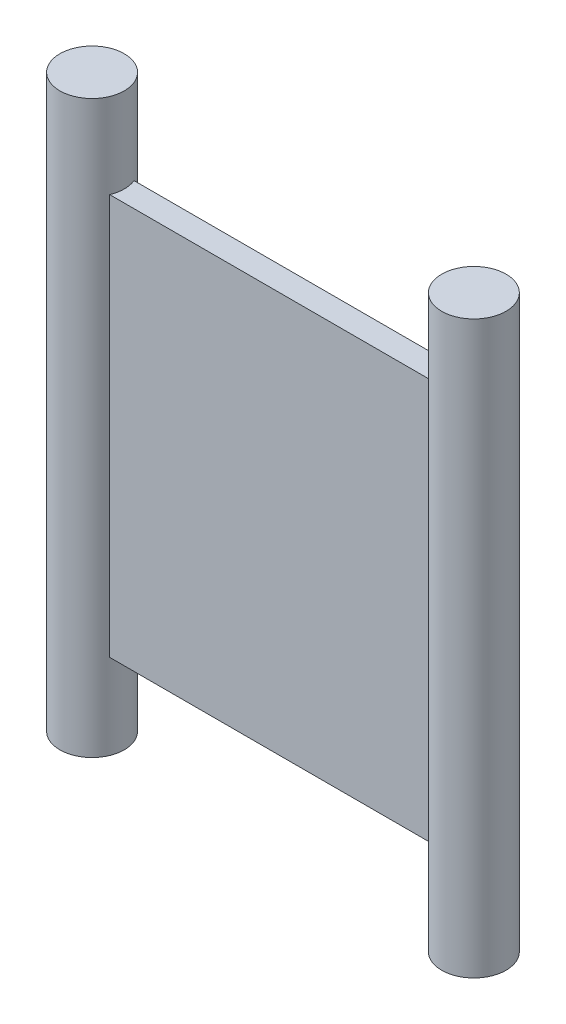
ISO-10303-21;
HEADER;
FILE_DESCRIPTION(('STEP AP214'),'2;1');
FILE_NAME('part.step','',(''),(''),'','','');
FILE_SCHEMA(('AUTOMOTIVE_DESIGN { 1 0 10303 214 1 1 1 1 }'));
ENDSEC;
DATA;
#1=APPLICATION_CONTEXT('core data for automotive mechanical design processes');
#2=APPLICATION_PROTOCOL_DEFINITION('international standard','automotive_design',2000,#1);
#3=PRODUCT_CONTEXT('',#1,'mechanical');
#4=PRODUCT('Part','Part','',(#3));
#5=PRODUCT_RELATED_PRODUCT_CATEGORY('part','',(#4));
#6=PRODUCT_DEFINITION_FORMATION('','',#4);
#7=PRODUCT_DEFINITION_CONTEXT('part definition',#1,'design');
#8=PRODUCT_DEFINITION('design','',#6,#7);
#9=PRODUCT_DEFINITION_SHAPE('','',#8);
#10=(LENGTH_UNIT() NAMED_UNIT(*) SI_UNIT(.MILLI.,.METRE.));
#11=(NAMED_UNIT(*) PLANE_ANGLE_UNIT() SI_UNIT($,.RADIAN.));
#12=(NAMED_UNIT(*) SI_UNIT($,.STERADIAN.) SOLID_ANGLE_UNIT());
#13=UNCERTAINTY_MEASURE_WITH_UNIT(LENGTH_MEASURE(1.E-05),#10,'distance_accuracy_value','');
#14=(GEOMETRIC_REPRESENTATION_CONTEXT(3) GLOBAL_UNCERTAINTY_ASSIGNED_CONTEXT((#13)) GLOBAL_UNIT_ASSIGNED_CONTEXT((#10,
#11,#12)) REPRESENTATION_CONTEXT('',''));
#15=CARTESIAN_POINT('',(0.,0.,0.));
#16=DIRECTION('',(0.,0.,1.));
#17=DIRECTION('',(1.,0.,0.));
#18=AXIS2_PLACEMENT_3D('',#15,#16,#17);
#19=CARTESIAN_POINT('',(7.86,16.5,0.499999999999999));
#20=DIRECTION('',(0.,0.,-1.));
#21=DIRECTION('',(-1.,0.,0.));
#22=AXIS2_PLACEMENT_3D('',#19,#20,#21);
#23=PLANE('',#22);
#24=DIRECTION('',(0.,-1.,0.));
#25=VECTOR('',#24,1.);
#26=CARTESIAN_POINT('',(6.6329608808192,20.,0.499999999999999));
#27=LINE('',#26,#25);
#28=CARTESIAN_POINT('',(6.6329608808192,16.5,0.499999999999999));
#29=VERTEX_POINT('',#28);
#30=CARTESIAN_POINT('',(6.6329608808192,0.,0.499999999999999));
#31=VERTEX_POINT('',#30);
#32=EDGE_CURVE('E53',#29,#31,#27,.T.);
#33=ORIENTED_EDGE('',*,*,#32,.F.);
#34=DIRECTION('',(1.,0.,0.));
#35=VECTOR('',#34,1.);
#36=CARTESIAN_POINT('',(7.86,16.5,0.499999999999999));
#37=LINE('',#36,#35);
#38=CARTESIAN_POINT('',(-6.6329608808192,16.5,0.500000000000001));
#39=VERTEX_POINT('',#38);
#40=EDGE_CURVE('E90',#39,#29,#37,.T.);
#41=ORIENTED_EDGE('',*,*,#40,.F.);
#42=DIRECTION('',(0.,-1.,0.));
#43=VECTOR('',#42,1.);
#44=CARTESIAN_POINT('',(-6.6329608808192,20.,0.500000000000001));
#45=LINE('',#44,#43);
#46=CARTESIAN_POINT('',(-6.6329608808192,0.,0.500000000000001));
#47=VERTEX_POINT('',#46);
#48=EDGE_CURVE('E103',#47,#39,#45,.F.);
#49=ORIENTED_EDGE('',*,*,#48,.F.);
#50=DIRECTION('',(1.,0.,0.));
#51=VECTOR('',#50,1.);
#52=CARTESIAN_POINT('',(7.86,0.,0.499999999999999));
#53=LINE('',#52,#51);
#54=EDGE_CURVE('E91',#47,#31,#53,.T.);
#55=ORIENTED_EDGE('',*,*,#54,.T.);
#56=EDGE_LOOP('',(#33,#41,#49,#55));
#57=FACE_BOUND('',#56,.T.);
#58=ADVANCED_FACE('F39',(#57),#23,.F.);
#59=CARTESIAN_POINT('',(7.86,16.5,-0.500000000000001));
#60=DIRECTION('',(0.,0.,1.));
#61=DIRECTION('',(1.,0.,0.));
#62=AXIS2_PLACEMENT_3D('',#59,#60,#61);
#63=PLANE('',#62);
#64=DIRECTION('',(0.,-1.,0.));
#65=VECTOR('',#64,1.);
#66=CARTESIAN_POINT('',(6.6329608808192,20.,-0.500000000000001));
#67=LINE('',#66,#65);
#68=CARTESIAN_POINT('',(6.6329608808192,0.,-0.500000000000001));
#69=VERTEX_POINT('',#68);
#70=CARTESIAN_POINT('',(6.6329608808192,16.5,-0.500000000000001));
#71=VERTEX_POINT('',#70);
#72=EDGE_CURVE('E78',#69,#71,#67,.F.);
#73=ORIENTED_EDGE('',*,*,#72,.F.);
#74=DIRECTION('',(-1.,0.,0.));
#75=VECTOR('',#74,1.);
#76=CARTESIAN_POINT('',(7.86,0.,-0.500000000000001));
#77=LINE('',#76,#75);
#78=CARTESIAN_POINT('',(-6.63296088081919,0.,-0.499999999999999));
#79=VERTEX_POINT('',#78);
#80=EDGE_CURVE('E60',#69,#79,#77,.T.);
#81=ORIENTED_EDGE('',*,*,#80,.T.);
#82=DIRECTION('',(0.,-1.,0.));
#83=VECTOR('',#82,1.);
#84=CARTESIAN_POINT('',(-6.63296088081919,20.,-0.499999999999999));
#85=LINE('',#84,#83);
#86=CARTESIAN_POINT('',(-6.63296088081919,16.5,-0.499999999999999));
#87=VERTEX_POINT('',#86);
#88=EDGE_CURVE('E105',#87,#79,#85,.T.);
#89=ORIENTED_EDGE('',*,*,#88,.F.);
#90=DIRECTION('',(-1.,0.,0.));
#91=VECTOR('',#90,1.);
#92=CARTESIAN_POINT('',(7.86,16.5,-0.500000000000001));
#93=LINE('',#92,#91);
#94=EDGE_CURVE('E85',#71,#87,#93,.T.);
#95=ORIENTED_EDGE('',*,*,#94,.F.);
#96=EDGE_LOOP('',(#73,#81,#89,#95));
#97=FACE_BOUND('',#96,.T.);
#98=ADVANCED_FACE('F84',(#97),#63,.F.);
#99=CARTESIAN_POINT('',(-7.86,20.,0.));
#100=DIRECTION('',(0.,-1.,0.));
#101=DIRECTION('',(0.,0.,-1.));
#102=AXIS2_PLACEMENT_3D('',#99,#100,#101);
#103=CYLINDRICAL_SURFACE('',#102,1.325);
#104=CARTESIAN_POINT('',(-7.86,20.,0.));
#105=DIRECTION('',(0.,1.,0.));
#106=DIRECTION('',(0.,0.,1.));
#107=AXIS2_PLACEMENT_3D('',#104,#105,#106);
#108=CIRCLE('',#107,1.325);
#109=CARTESIAN_POINT('',(-7.86,20.,1.325));
#110=VERTEX_POINT('',#109);
#111=EDGE_CURVE('E107',#110,#110,#108,.T.);
#112=ORIENTED_EDGE('',*,*,#111,.F.);
#113=EDGE_LOOP('',(#112));
#114=FACE_BOUND('',#113,.T.);
#115=CARTESIAN_POINT('',(-7.86,-3.5,0.));
#116=DIRECTION('',(0.,1.,0.));
#117=DIRECTION('',(0.,0.,1.));
#118=AXIS2_PLACEMENT_3D('',#115,#116,#117);
#119=CIRCLE('',#118,1.325);
#120=CARTESIAN_POINT('',(-7.86,-3.5,1.325));
#121=VERTEX_POINT('',#120);
#122=EDGE_CURVE('E108',#121,#121,#119,.T.);
#123=ORIENTED_EDGE('',*,*,#122,.T.);
#124=EDGE_LOOP('',(#123));
#125=FACE_BOUND('',#124,.T.);
#126=ORIENTED_EDGE('',*,*,#48,.T.);
#127=CARTESIAN_POINT('',(-7.86,16.5,0.));
#128=DIRECTION('',(0.,-1.,0.));
#129=DIRECTION('',(0.,0.,-1.));
#130=AXIS2_PLACEMENT_3D('',#127,#128,#129);
#131=CIRCLE('',#130,1.325);
#132=EDGE_CURVE('E95',#39,#87,#131,.F.);
#133=ORIENTED_EDGE('',*,*,#132,.T.);
#134=ORIENTED_EDGE('',*,*,#88,.T.);
#135=CARTESIAN_POINT('',(-7.86,0.,0.));
#136=DIRECTION('',(0.,-1.,0.));
#137=DIRECTION('',(0.,0.,-1.));
#138=AXIS2_PLACEMENT_3D('',#135,#136,#137);
#139=CIRCLE('',#138,1.325);
#140=EDGE_CURVE('E46',#47,#79,#139,.F.);
#141=ORIENTED_EDGE('',*,*,#140,.F.);
#142=EDGE_LOOP('',(#126,#133,#134,#141));
#143=FACE_BOUND('',#142,.T.);
#144=ADVANCED_FACE('F138',(#114,#125,#143),#103,.T.);
#145=CARTESIAN_POINT('',(-7.86,20.,0.));
#146=DIRECTION('',(0.,1.,0.));
#147=DIRECTION('',(0.,0.,1.));
#148=AXIS2_PLACEMENT_3D('',#145,#146,#147);
#149=PLANE('',#148);
#150=ORIENTED_EDGE('',*,*,#111,.T.);
#151=EDGE_LOOP('',(#150));
#152=FACE_BOUND('',#151,.T.);
#153=ADVANCED_FACE('F144',(#152),#149,.T.);
#154=CARTESIAN_POINT('',(-7.86,-3.5,0.));
#155=DIRECTION('',(0.,1.,0.));
#156=DIRECTION('',(0.,0.,1.));
#157=AXIS2_PLACEMENT_3D('',#154,#155,#156);
#158=PLANE('',#157);
#159=ORIENTED_EDGE('',*,*,#122,.F.);
#160=EDGE_LOOP('',(#159));
#161=FACE_BOUND('',#160,.T.);
#162=ADVANCED_FACE('F150',(#161),#158,.F.);
#163=CARTESIAN_POINT('',(0.,16.5,0.));
#164=DIRECTION('',(0.,-1.,0.));
#165=DIRECTION('',(0.,0.,-1.));
#166=AXIS2_PLACEMENT_3D('',#163,#164,#165);
#167=PLANE('',#166);
#168=CARTESIAN_POINT('',(7.86,16.5,0.));
#169=DIRECTION('',(0.,-1.,0.));
#170=DIRECTION('',(0.,0.,-1.));
#171=AXIS2_PLACEMENT_3D('',#168,#169,#170);
#172=CIRCLE('',#171,1.325);
#173=EDGE_CURVE('E111',#71,#29,#172,.F.);
#174=ORIENTED_EDGE('',*,*,#173,.F.);
#175=ORIENTED_EDGE('',*,*,#94,.T.);
#176=ORIENTED_EDGE('',*,*,#132,.F.);
#177=ORIENTED_EDGE('',*,*,#40,.T.);
#178=EDGE_LOOP('',(#174,#175,#176,#177));
#179=FACE_BOUND('',#178,.T.);
#180=ADVANCED_FACE('F141',(#179),#167,.F.);
#181=CARTESIAN_POINT('',(0.,0.,0.));
#182=DIRECTION('',(0.,-1.,0.));
#183=DIRECTION('',(0.,0.,-1.));
#184=AXIS2_PLACEMENT_3D('',#181,#182,#183);
#185=PLANE('',#184);
#186=ORIENTED_EDGE('',*,*,#80,.F.);
#187=CARTESIAN_POINT('',(7.86,0.,0.));
#188=DIRECTION('',(0.,-1.,0.));
#189=DIRECTION('',(0.,0.,-1.));
#190=AXIS2_PLACEMENT_3D('',#187,#188,#189);
#191=CIRCLE('',#190,1.325);
#192=EDGE_CURVE('E11',#69,#31,#191,.F.);
#193=ORIENTED_EDGE('',*,*,#192,.T.);
#194=ORIENTED_EDGE('',*,*,#54,.F.);
#195=ORIENTED_EDGE('',*,*,#140,.T.);
#196=EDGE_LOOP('',(#186,#193,#194,#195));
#197=FACE_BOUND('',#196,.T.);
#198=ADVANCED_FACE('F89',(#197),#185,.T.);
#199=CARTESIAN_POINT('',(7.86,20.,0.));
#200=DIRECTION('',(0.,-1.,0.));
#201=DIRECTION('',(0.,0.,-1.));
#202=AXIS2_PLACEMENT_3D('',#199,#200,#201);
#203=CYLINDRICAL_SURFACE('',#202,1.325);
#204=CARTESIAN_POINT('',(7.86,20.,0.));
#205=DIRECTION('',(0.,1.,0.));
#206=DIRECTION('',(0.,0.,1.));
#207=AXIS2_PLACEMENT_3D('',#204,#205,#206);
#208=CIRCLE('',#207,1.325);
#209=CARTESIAN_POINT('',(7.86,20.,1.325));
#210=VERTEX_POINT('',#209);
#211=EDGE_CURVE('E116',#210,#210,#208,.T.);
#212=ORIENTED_EDGE('',*,*,#211,.F.);
#213=EDGE_LOOP('',(#212));
#214=FACE_BOUND('',#213,.T.);
#215=CARTESIAN_POINT('',(7.86,-3.5,0.));
#216=DIRECTION('',(0.,1.,0.));
#217=DIRECTION('',(0.,0.,1.));
#218=AXIS2_PLACEMENT_3D('',#215,#216,#217);
#219=CIRCLE('',#218,1.325);
#220=CARTESIAN_POINT('',(7.86,-3.5,1.325));
#221=VERTEX_POINT('',#220);
#222=EDGE_CURVE('E86',#221,#221,#219,.T.);
#223=ORIENTED_EDGE('',*,*,#222,.T.);
#224=EDGE_LOOP('',(#223));
#225=FACE_BOUND('',#224,.T.);
#226=ORIENTED_EDGE('',*,*,#72,.T.);
#227=ORIENTED_EDGE('',*,*,#173,.T.);
#228=ORIENTED_EDGE('',*,*,#32,.T.);
#229=ORIENTED_EDGE('',*,*,#192,.F.);
#230=EDGE_LOOP('',(#226,#227,#228,#229));
#231=FACE_BOUND('',#230,.T.);
#232=ADVANCED_FACE('F77',(#214,#225,#231),#203,.T.);
#233=CARTESIAN_POINT('',(7.86,20.,0.));
#234=DIRECTION('',(0.,1.,0.));
#235=DIRECTION('',(0.,0.,1.));
#236=AXIS2_PLACEMENT_3D('',#233,#234,#235);
#237=PLANE('',#236);
#238=ORIENTED_EDGE('',*,*,#211,.T.);
#239=EDGE_LOOP('',(#238));
#240=FACE_BOUND('',#239,.T.);
#241=ADVANCED_FACE('F125',(#240),#237,.T.);
#242=CARTESIAN_POINT('',(7.86,-3.5,0.));
#243=DIRECTION('',(0.,1.,0.));
#244=DIRECTION('',(0.,0.,1.));
#245=AXIS2_PLACEMENT_3D('',#242,#243,#244);
#246=PLANE('',#245);
#247=ORIENTED_EDGE('',*,*,#222,.F.);
#248=EDGE_LOOP('',(#247));
#249=FACE_BOUND('',#248,.T.);
#250=ADVANCED_FACE('F123',(#249),#246,.F.);
#251=CLOSED_SHELL('',(#58,#98,#144,#153,#162,#180,#198,#232,#241,#250));
#252=MANIFOLD_SOLID_BREP('B2',#251);
#253=ADVANCED_BREP_SHAPE_REPRESENTATION('',(#18,#252),#14);
#254=SHAPE_DEFINITION_REPRESENTATION(#9,#253);
ENDSEC;
END-ISO-10303-21;
